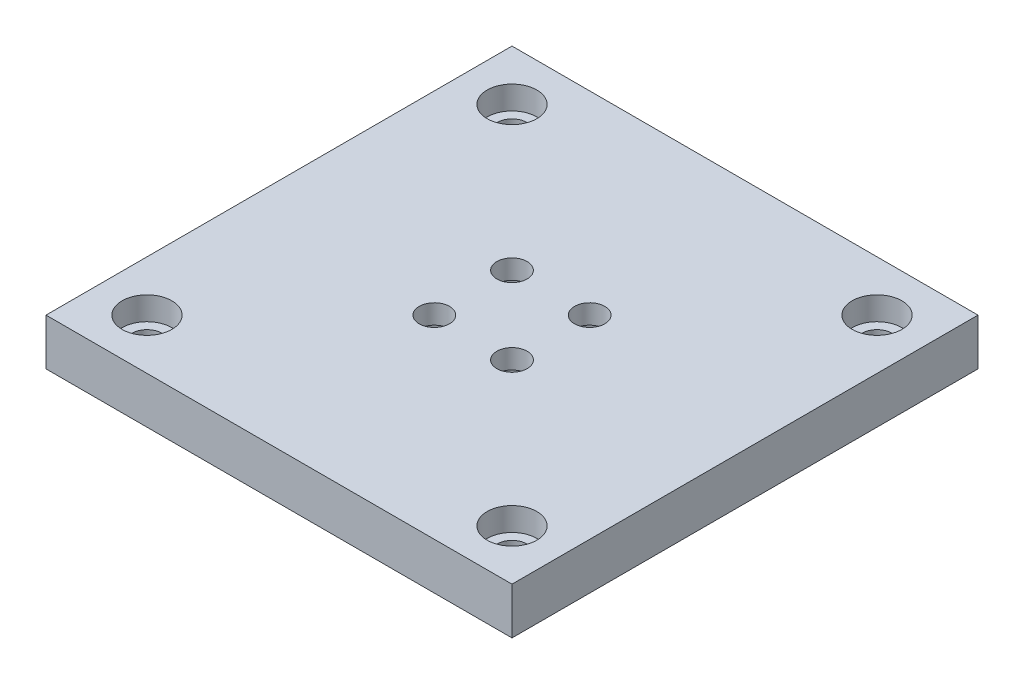
ISO-10303-21;
HEADER;
FILE_DESCRIPTION(('STEP AP214'),'2;1');
FILE_NAME('part.step','',(''),(''),'','','');
FILE_SCHEMA(('AUTOMOTIVE_DESIGN { 1 0 10303 214 1 1 1 1 }'));
ENDSEC;
DATA;
#1=APPLICATION_CONTEXT('core data for automotive mechanical design processes');
#2=APPLICATION_PROTOCOL_DEFINITION('international standard','automotive_design',2000,#1);
#3=PRODUCT_CONTEXT('',#1,'mechanical');
#4=PRODUCT('Part','Part','',(#3));
#5=PRODUCT_RELATED_PRODUCT_CATEGORY('part','',(#4));
#6=PRODUCT_DEFINITION_FORMATION('','',#4);
#7=PRODUCT_DEFINITION_CONTEXT('part definition',#1,'design');
#8=PRODUCT_DEFINITION('design','',#6,#7);
#9=PRODUCT_DEFINITION_SHAPE('','',#8);
#10=(LENGTH_UNIT() NAMED_UNIT(*) SI_UNIT(.MILLI.,.METRE.));
#11=(NAMED_UNIT(*) PLANE_ANGLE_UNIT() SI_UNIT($,.RADIAN.));
#12=(NAMED_UNIT(*) SI_UNIT($,.STERADIAN.) SOLID_ANGLE_UNIT());
#13=UNCERTAINTY_MEASURE_WITH_UNIT(LENGTH_MEASURE(1.E-05),#10,'distance_accuracy_value','');
#14=(GEOMETRIC_REPRESENTATION_CONTEXT(3) GLOBAL_UNCERTAINTY_ASSIGNED_CONTEXT((#13)) GLOBAL_UNIT_ASSIGNED_CONTEXT((#10,
#11,#12)) REPRESENTATION_CONTEXT('',''));
#15=CARTESIAN_POINT('',(0.,0.,0.));
#16=DIRECTION('',(0.,0.,1.));
#17=DIRECTION('',(1.,0.,0.));
#18=AXIS2_PLACEMENT_3D('',#15,#16,#17);
#19=CARTESIAN_POINT('',(-5.,6.,0.));
#20=DIRECTION('',(1.,0.,0.));
#21=DIRECTION('',(0.,0.,-1.));
#22=AXIS2_PLACEMENT_3D('',#19,#20,#21);
#23=PLANE('',#22);
#24=DIRECTION('',(0.,0.,1.));
#25=VECTOR('',#24,1.);
#26=CARTESIAN_POINT('',(-5.,0.,0.));
#27=LINE('',#26,#25);
#28=CARTESIAN_POINT('',(-5.,0.,-60.));
#29=VERTEX_POINT('',#28);
#30=CARTESIAN_POINT('',(-5.,0.,0.));
#31=VERTEX_POINT('',#30);
#32=EDGE_CURVE('E104',#29,#31,#27,.T.);
#33=ORIENTED_EDGE('',*,*,#32,.T.);
#34=DIRECTION('',(0.,-1.,0.));
#35=VECTOR('',#34,1.);
#36=CARTESIAN_POINT('',(-5.,6.,0.));
#37=LINE('',#36,#35);
#38=CARTESIAN_POINT('',(-5.,6.,0.));
#39=VERTEX_POINT('',#38);
#40=EDGE_CURVE('E11',#39,#31,#37,.T.);
#41=ORIENTED_EDGE('',*,*,#40,.F.);
#42=DIRECTION('',(0.,0.,1.));
#43=VECTOR('',#42,1.);
#44=CARTESIAN_POINT('',(-5.,6.,0.));
#45=LINE('',#44,#43);
#46=CARTESIAN_POINT('',(-5.,6.,-60.));
#47=VERTEX_POINT('',#46);
#48=EDGE_CURVE('E91',#47,#39,#45,.T.);
#49=ORIENTED_EDGE('',*,*,#48,.F.);
#50=DIRECTION('',(0.,-1.,0.));
#51=VECTOR('',#50,1.);
#52=CARTESIAN_POINT('',(-5.,6.,-60.));
#53=LINE('',#52,#51);
#54=EDGE_CURVE('E100',#47,#29,#53,.T.);
#55=ORIENTED_EDGE('',*,*,#54,.T.);
#56=EDGE_LOOP('',(#33,#41,#49,#55));
#57=FACE_BOUND('',#56,.T.);
#58=ADVANCED_FACE('F38',(#57),#23,.F.);
#59=CARTESIAN_POINT('',(-5.,6.,0.));
#60=DIRECTION('',(0.,0.,-1.));
#61=DIRECTION('',(-1.,0.,0.));
#62=AXIS2_PLACEMENT_3D('',#59,#60,#61);
#63=PLANE('',#62);
#64=DIRECTION('',(1.,0.,0.));
#65=VECTOR('',#64,1.);
#66=CARTESIAN_POINT('',(-5.,0.,0.));
#67=LINE('',#66,#65);
#68=CARTESIAN_POINT('',(55.,0.,0.));
#69=VERTEX_POINT('',#68);
#70=EDGE_CURVE('E95',#31,#69,#67,.T.);
#71=ORIENTED_EDGE('',*,*,#70,.T.);
#72=DIRECTION('',(0.,-1.,0.));
#73=VECTOR('',#72,1.);
#74=CARTESIAN_POINT('',(55.,6.,0.));
#75=LINE('',#74,#73);
#76=CARTESIAN_POINT('',(55.,6.,0.));
#77=VERTEX_POINT('',#76);
#78=EDGE_CURVE('E47',#77,#69,#75,.T.);
#79=ORIENTED_EDGE('',*,*,#78,.F.);
#80=DIRECTION('',(1.,0.,0.));
#81=VECTOR('',#80,1.);
#82=CARTESIAN_POINT('',(-5.,6.,0.));
#83=LINE('',#82,#81);
#84=EDGE_CURVE('E86',#39,#77,#83,.T.);
#85=ORIENTED_EDGE('',*,*,#84,.F.);
#86=ORIENTED_EDGE('',*,*,#40,.T.);
#87=EDGE_LOOP('',(#71,#79,#85,#86));
#88=FACE_BOUND('',#87,.T.);
#89=ADVANCED_FACE('F94',(#88),#63,.F.);
#90=CARTESIAN_POINT('',(55.,6.,0.));
#91=DIRECTION('',(-1.,0.,0.));
#92=DIRECTION('',(0.,0.,1.));
#93=AXIS2_PLACEMENT_3D('',#90,#91,#92);
#94=PLANE('',#93);
#95=DIRECTION('',(0.,0.,-1.));
#96=VECTOR('',#95,1.);
#97=CARTESIAN_POINT('',(55.,0.,0.));
#98=LINE('',#97,#96);
#99=CARTESIAN_POINT('',(55.,0.,-60.));
#100=VERTEX_POINT('',#99);
#101=EDGE_CURVE('E73',#69,#100,#98,.T.);
#102=ORIENTED_EDGE('',*,*,#101,.T.);
#103=DIRECTION('',(0.,-1.,0.));
#104=VECTOR('',#103,1.);
#105=CARTESIAN_POINT('',(55.,6.,-60.));
#106=LINE('',#105,#104);
#107=CARTESIAN_POINT('',(55.,6.,-60.));
#108=VERTEX_POINT('',#107);
#109=EDGE_CURVE('E96',#108,#100,#106,.T.);
#110=ORIENTED_EDGE('',*,*,#109,.F.);
#111=DIRECTION('',(0.,0.,-1.));
#112=VECTOR('',#111,1.);
#113=CARTESIAN_POINT('',(55.,6.,0.));
#114=LINE('',#113,#112);
#115=EDGE_CURVE('E89',#77,#108,#114,.T.);
#116=ORIENTED_EDGE('',*,*,#115,.F.);
#117=ORIENTED_EDGE('',*,*,#78,.T.);
#118=EDGE_LOOP('',(#102,#110,#116,#117));
#119=FACE_BOUND('',#118,.T.);
#120=ADVANCED_FACE('F98',(#119),#94,.F.);
#121=CARTESIAN_POINT('',(-5.,6.,-60.));
#122=DIRECTION('',(0.,0.,1.));
#123=DIRECTION('',(1.,0.,0.));
#124=AXIS2_PLACEMENT_3D('',#121,#122,#123);
#125=PLANE('',#124);
#126=DIRECTION('',(-1.,0.,0.));
#127=VECTOR('',#126,1.);
#128=CARTESIAN_POINT('',(-5.,0.,-60.));
#129=LINE('',#128,#127);
#130=EDGE_CURVE('E79',#100,#29,#129,.T.);
#131=ORIENTED_EDGE('',*,*,#130,.T.);
#132=ORIENTED_EDGE('',*,*,#54,.F.);
#133=DIRECTION('',(-1.,0.,0.));
#134=VECTOR('',#133,1.);
#135=CARTESIAN_POINT('',(-5.,6.,-60.));
#136=LINE('',#135,#134);
#137=EDGE_CURVE('E56',#108,#47,#136,.T.);
#138=ORIENTED_EDGE('',*,*,#137,.F.);
#139=ORIENTED_EDGE('',*,*,#109,.T.);
#140=EDGE_LOOP('',(#131,#132,#138,#139));
#141=FACE_BOUND('',#140,.T.);
#142=ADVANCED_FACE('F226',(#141),#125,.F.);
#143=CARTESIAN_POINT('',(0.,6.,0.));
#144=DIRECTION('',(0.,-1.,0.));
#145=DIRECTION('',(0.,0.,-1.));
#146=AXIS2_PLACEMENT_3D('',#143,#144,#145);
#147=PLANE('',#146);
#148=CARTESIAN_POINT('',(1.5,6.,-53.5));
#149=DIRECTION('',(0.,1.,0.));
#150=DIRECTION('',(0.,0.,1.));
#151=AXIS2_PLACEMENT_3D('',#148,#149,#150);
#152=CIRCLE('',#151,3.20000000000002);
#153=CARTESIAN_POINT('',(1.5,6.,-50.3));
#154=VERTEX_POINT('',#153);
#155=EDGE_CURVE('E498',#154,#154,#152,.T.);
#156=ORIENTED_EDGE('',*,*,#155,.F.);
#157=EDGE_LOOP('',(#156));
#158=FACE_BOUND('',#157,.T.);
#159=CARTESIAN_POINT('',(48.5,6.,-53.5));
#160=DIRECTION('',(0.,1.,0.));
#161=DIRECTION('',(0.,0.,1.));
#162=AXIS2_PLACEMENT_3D('',#159,#160,#161);
#163=CIRCLE('',#162,3.20000000000002);
#164=CARTESIAN_POINT('',(48.5,6.,-50.3));
#165=VERTEX_POINT('',#164);
#166=EDGE_CURVE('E137',#165,#165,#163,.T.);
#167=ORIENTED_EDGE('',*,*,#166,.F.);
#168=EDGE_LOOP('',(#167));
#169=FACE_BOUND('',#168,.T.);
#170=CARTESIAN_POINT('',(48.5,6.,-6.5));
#171=DIRECTION('',(0.,1.,0.));
#172=DIRECTION('',(0.,0.,1.));
#173=AXIS2_PLACEMENT_3D('',#170,#171,#172);
#174=CIRCLE('',#173,3.20000000000002);
#175=CARTESIAN_POINT('',(48.5,6.,-3.29999999999998));
#176=VERTEX_POINT('',#175);
#177=EDGE_CURVE('E124',#176,#176,#174,.T.);
#178=ORIENTED_EDGE('',*,*,#177,.F.);
#179=EDGE_LOOP('',(#178));
#180=FACE_BOUND('',#179,.T.);
#181=CARTESIAN_POINT('',(1.5,6.,-6.5));
#182=DIRECTION('',(0.,1.,0.));
#183=DIRECTION('',(0.,0.,1.));
#184=AXIS2_PLACEMENT_3D('',#181,#182,#183);
#185=CIRCLE('',#184,3.20000000000002);
#186=CARTESIAN_POINT('',(1.5,6.,-3.29999999999998));
#187=VERTEX_POINT('',#186);
#188=EDGE_CURVE('E120',#187,#187,#185,.T.);
#189=ORIENTED_EDGE('',*,*,#188,.F.);
#190=EDGE_LOOP('',(#189));
#191=FACE_BOUND('',#190,.T.);
#192=CARTESIAN_POINT('',(20.,6.,-25.));
#193=DIRECTION('',(0.,-1.,0.));
#194=DIRECTION('',(0.,0.,-1.));
#195=AXIS2_PLACEMENT_3D('',#192,#193,#194);
#196=CIRCLE('',#195,1.95000000000001);
#197=CARTESIAN_POINT('',(20.,6.,-26.95));
#198=VERTEX_POINT('',#197);
#199=EDGE_CURVE('E160',#198,#198,#196,.T.);
#200=ORIENTED_EDGE('',*,*,#199,.T.);
#201=EDGE_LOOP('',(#200));
#202=FACE_BOUND('',#201,.T.);
#203=CARTESIAN_POINT('',(30.,6.,-25.));
#204=DIRECTION('',(0.,-1.,0.));
#205=DIRECTION('',(0.,0.,-1.));
#206=AXIS2_PLACEMENT_3D('',#203,#204,#205);
#207=CIRCLE('',#206,1.95000000000001);
#208=CARTESIAN_POINT('',(30.,6.,-26.95));
#209=VERTEX_POINT('',#208);
#210=EDGE_CURVE('E172',#209,#209,#207,.T.);
#211=ORIENTED_EDGE('',*,*,#210,.T.);
#212=EDGE_LOOP('',(#211));
#213=FACE_BOUND('',#212,.T.);
#214=CARTESIAN_POINT('',(30.,6.,-35.));
#215=DIRECTION('',(0.,-1.,0.));
#216=DIRECTION('',(0.,0.,-1.));
#217=AXIS2_PLACEMENT_3D('',#214,#215,#216);
#218=CIRCLE('',#217,1.95000000000001);
#219=CARTESIAN_POINT('',(30.,6.,-36.95));
#220=VERTEX_POINT('',#219);
#221=EDGE_CURVE('E184',#220,#220,#218,.T.);
#222=ORIENTED_EDGE('',*,*,#221,.T.);
#223=EDGE_LOOP('',(#222));
#224=FACE_BOUND('',#223,.T.);
#225=CARTESIAN_POINT('',(20.,6.,-35.));
#226=DIRECTION('',(0.,-1.,0.));
#227=DIRECTION('',(0.,0.,-1.));
#228=AXIS2_PLACEMENT_3D('',#225,#226,#227);
#229=CIRCLE('',#228,1.95000000000001);
#230=CARTESIAN_POINT('',(20.,6.,-36.95));
#231=VERTEX_POINT('',#230);
#232=EDGE_CURVE('E107',#231,#231,#229,.T.);
#233=ORIENTED_EDGE('',*,*,#232,.T.);
#234=EDGE_LOOP('',(#233));
#235=FACE_BOUND('',#234,.T.);
#236=ORIENTED_EDGE('',*,*,#48,.T.);
#237=ORIENTED_EDGE('',*,*,#84,.T.);
#238=ORIENTED_EDGE('',*,*,#115,.T.);
#239=ORIENTED_EDGE('',*,*,#137,.T.);
#240=EDGE_LOOP('',(#236,#237,#238,#239));
#241=FACE_BOUND('',#240,.T.);
#242=ADVANCED_FACE('F87',(#158,#169,#180,#191,#202,#213,#224,#235,#241),#147,.F.);
#243=CARTESIAN_POINT('',(0.,0.,0.));
#244=DIRECTION('',(0.,-1.,0.));
#245=DIRECTION('',(0.,0.,-1.));
#246=AXIS2_PLACEMENT_3D('',#243,#244,#245);
#247=PLANE('',#246);
#248=CARTESIAN_POINT('',(1.5,0.,-53.5));
#249=DIRECTION('',(0.,-1.,0.));
#250=DIRECTION('',(0.,0.,-1.));
#251=AXIS2_PLACEMENT_3D('',#248,#249,#250);
#252=CIRCLE('',#251,1.95000000000001);
#253=CARTESIAN_POINT('',(1.5,0.,-55.45));
#254=VERTEX_POINT('',#253);
#255=EDGE_CURVE('E41',#254,#254,#252,.T.);
#256=ORIENTED_EDGE('',*,*,#255,.F.);
#257=EDGE_LOOP('',(#256));
#258=FACE_BOUND('',#257,.T.);
#259=CARTESIAN_POINT('',(48.5,0.,-53.5));
#260=DIRECTION('',(0.,-1.,0.));
#261=DIRECTION('',(0.,0.,-1.));
#262=AXIS2_PLACEMENT_3D('',#259,#260,#261);
#263=CIRCLE('',#262,1.95000000000001);
#264=CARTESIAN_POINT('',(48.5,0.,-55.45));
#265=VERTEX_POINT('',#264);
#266=EDGE_CURVE('E122',#265,#265,#263,.T.);
#267=ORIENTED_EDGE('',*,*,#266,.F.);
#268=EDGE_LOOP('',(#267));
#269=FACE_BOUND('',#268,.T.);
#270=CARTESIAN_POINT('',(48.5,0.,-6.5));
#271=DIRECTION('',(0.,-1.,0.));
#272=DIRECTION('',(0.,0.,-1.));
#273=AXIS2_PLACEMENT_3D('',#270,#271,#272);
#274=CIRCLE('',#273,1.95000000000001);
#275=CARTESIAN_POINT('',(48.5,0.,-8.45000000000001));
#276=VERTEX_POINT('',#275);
#277=EDGE_CURVE('E118',#276,#276,#274,.T.);
#278=ORIENTED_EDGE('',*,*,#277,.F.);
#279=EDGE_LOOP('',(#278));
#280=FACE_BOUND('',#279,.T.);
#281=CARTESIAN_POINT('',(1.5,0.,-6.5));
#282=DIRECTION('',(0.,-1.,0.));
#283=DIRECTION('',(0.,0.,-1.));
#284=AXIS2_PLACEMENT_3D('',#281,#282,#283);
#285=CIRCLE('',#284,1.95000000000001);
#286=CARTESIAN_POINT('',(1.5,0.,-8.45000000000001));
#287=VERTEX_POINT('',#286);
#288=EDGE_CURVE('E113',#287,#287,#285,.T.);
#289=ORIENTED_EDGE('',*,*,#288,.F.);
#290=EDGE_LOOP('',(#289));
#291=FACE_BOUND('',#290,.T.);
#292=CARTESIAN_POINT('',(20.,0.,-25.));
#293=DIRECTION('',(0.,-1.,0.));
#294=DIRECTION('',(0.,0.,-1.));
#295=AXIS2_PLACEMENT_3D('',#292,#293,#294);
#296=CIRCLE('',#295,3.20000000000001);
#297=CARTESIAN_POINT('',(20.,0.,-28.2));
#298=VERTEX_POINT('',#297);
#299=EDGE_CURVE('E116',#298,#298,#296,.T.);
#300=ORIENTED_EDGE('',*,*,#299,.F.);
#301=EDGE_LOOP('',(#300));
#302=FACE_BOUND('',#301,.T.);
#303=CARTESIAN_POINT('',(30.,0.,-25.));
#304=DIRECTION('',(0.,-1.,0.));
#305=DIRECTION('',(0.,0.,-1.));
#306=AXIS2_PLACEMENT_3D('',#303,#304,#305);
#307=CIRCLE('',#306,3.20000000000002);
#308=CARTESIAN_POINT('',(30.,0.,-28.2));
#309=VERTEX_POINT('',#308);
#310=EDGE_CURVE('E163',#309,#309,#307,.T.);
#311=ORIENTED_EDGE('',*,*,#310,.F.);
#312=EDGE_LOOP('',(#311));
#313=FACE_BOUND('',#312,.T.);
#314=CARTESIAN_POINT('',(30.,0.,-35.));
#315=DIRECTION('',(0.,-1.,0.));
#316=DIRECTION('',(0.,0.,-1.));
#317=AXIS2_PLACEMENT_3D('',#314,#315,#316);
#318=CIRCLE('',#317,3.20000000000002);
#319=CARTESIAN_POINT('',(30.,0.,-38.2));
#320=VERTEX_POINT('',#319);
#321=EDGE_CURVE('E175',#320,#320,#318,.T.);
#322=ORIENTED_EDGE('',*,*,#321,.F.);
#323=EDGE_LOOP('',(#322));
#324=FACE_BOUND('',#323,.T.);
#325=CARTESIAN_POINT('',(20.,0.,-35.));
#326=DIRECTION('',(0.,-1.,0.));
#327=DIRECTION('',(0.,0.,-1.));
#328=AXIS2_PLACEMENT_3D('',#325,#326,#327);
#329=CIRCLE('',#328,3.20000000000001);
#330=CARTESIAN_POINT('',(20.,0.,-38.2));
#331=VERTEX_POINT('',#330);
#332=EDGE_CURVE('E187',#331,#331,#329,.T.);
#333=ORIENTED_EDGE('',*,*,#332,.F.);
#334=EDGE_LOOP('',(#333));
#335=FACE_BOUND('',#334,.T.);
#336=ORIENTED_EDGE('',*,*,#32,.F.);
#337=ORIENTED_EDGE('',*,*,#130,.F.);
#338=ORIENTED_EDGE('',*,*,#101,.F.);
#339=ORIENTED_EDGE('',*,*,#70,.F.);
#340=EDGE_LOOP('',(#336,#337,#338,#339));
#341=FACE_BOUND('',#340,.T.);
#342=ADVANCED_FACE('F204',(#258,#269,#280,#291,#302,#313,#324,#335,#341),#247,.T.);
#343=CARTESIAN_POINT('',(20.,0.,-35.));
#344=DIRECTION('',(0.,-1.,0.));
#345=DIRECTION('',(0.,0.,-1.));
#346=AXIS2_PLACEMENT_3D('',#343,#344,#345);
#347=CYLINDRICAL_SURFACE('',#346,1.95000000000001);
#348=ORIENTED_EDGE('',*,*,#232,.F.);
#349=EDGE_LOOP('',(#348));
#350=FACE_BOUND('',#349,.T.);
#351=CARTESIAN_POINT('',(20.,3.5,-35.));
#352=DIRECTION('',(0.,-1.,0.));
#353=DIRECTION('',(0.,0.,-1.));
#354=AXIS2_PLACEMENT_3D('',#351,#352,#353);
#355=CIRCLE('',#354,1.95000000000001);
#356=CARTESIAN_POINT('',(20.,3.5,-36.95));
#357=VERTEX_POINT('',#356);
#358=EDGE_CURVE('E193',#357,#357,#355,.T.);
#359=ORIENTED_EDGE('',*,*,#358,.T.);
#360=EDGE_LOOP('',(#359));
#361=FACE_BOUND('',#360,.T.);
#362=ADVANCED_FACE('F200',(#350,#361),#347,.F.);
#363=CARTESIAN_POINT('',(21.95,3.5,-35.));
#364=DIRECTION('',(0.,1.,0.));
#365=DIRECTION('',(0.,0.,1.));
#366=AXIS2_PLACEMENT_3D('',#363,#364,#365);
#367=PLANE('',#366);
#368=ORIENTED_EDGE('',*,*,#358,.F.);
#369=EDGE_LOOP('',(#368));
#370=FACE_BOUND('',#369,.T.);
#371=CARTESIAN_POINT('',(20.,3.5,-35.));
#372=DIRECTION('',(0.,-1.,0.));
#373=DIRECTION('',(0.,0.,-1.));
#374=AXIS2_PLACEMENT_3D('',#371,#372,#373);
#375=CIRCLE('',#374,3.20000000000001);
#376=CARTESIAN_POINT('',(20.,3.5,-38.2));
#377=VERTEX_POINT('',#376);
#378=EDGE_CURVE('E190',#377,#377,#375,.T.);
#379=ORIENTED_EDGE('',*,*,#378,.T.);
#380=EDGE_LOOP('',(#379));
#381=FACE_BOUND('',#380,.T.);
#382=ADVANCED_FACE('F203',(#370,#381),#367,.F.);
#383=CARTESIAN_POINT('',(20.,0.,-35.));
#384=DIRECTION('',(0.,-1.,0.));
#385=DIRECTION('',(0.,0.,-1.));
#386=AXIS2_PLACEMENT_3D('',#383,#384,#385);
#387=CYLINDRICAL_SURFACE('',#386,3.20000000000001);
#388=ORIENTED_EDGE('',*,*,#378,.F.);
#389=EDGE_LOOP('',(#388));
#390=FACE_BOUND('',#389,.T.);
#391=ORIENTED_EDGE('',*,*,#332,.T.);
#392=EDGE_LOOP('',(#391));
#393=FACE_BOUND('',#392,.T.);
#394=ADVANCED_FACE('F210',(#390,#393),#387,.F.);
#395=CARTESIAN_POINT('',(30.,0.,-35.));
#396=DIRECTION('',(0.,-1.,0.));
#397=DIRECTION('',(0.,0.,-1.));
#398=AXIS2_PLACEMENT_3D('',#395,#396,#397);
#399=CYLINDRICAL_SURFACE('',#398,1.95000000000001);
#400=ORIENTED_EDGE('',*,*,#221,.F.);
#401=EDGE_LOOP('',(#400));
#402=FACE_BOUND('',#401,.T.);
#403=CARTESIAN_POINT('',(30.,3.5,-35.));
#404=DIRECTION('',(0.,-1.,0.));
#405=DIRECTION('',(0.,0.,-1.));
#406=AXIS2_PLACEMENT_3D('',#403,#404,#405);
#407=CIRCLE('',#406,1.95000000000001);
#408=CARTESIAN_POINT('',(30.,3.5,-36.95));
#409=VERTEX_POINT('',#408);
#410=EDGE_CURVE('E181',#409,#409,#407,.T.);
#411=ORIENTED_EDGE('',*,*,#410,.T.);
#412=EDGE_LOOP('',(#411));
#413=FACE_BOUND('',#412,.T.);
#414=ADVANCED_FACE('F216',(#402,#413),#399,.F.);
#415=CARTESIAN_POINT('',(31.95,3.5,-35.));
#416=DIRECTION('',(0.,1.,0.));
#417=DIRECTION('',(0.,0.,1.));
#418=AXIS2_PLACEMENT_3D('',#415,#416,#417);
#419=PLANE('',#418);
#420=ORIENTED_EDGE('',*,*,#410,.F.);
#421=EDGE_LOOP('',(#420));
#422=FACE_BOUND('',#421,.T.);
#423=CARTESIAN_POINT('',(30.,3.5,-35.));
#424=DIRECTION('',(0.,-1.,0.));
#425=DIRECTION('',(0.,0.,-1.));
#426=AXIS2_PLACEMENT_3D('',#423,#424,#425);
#427=CIRCLE('',#426,3.20000000000002);
#428=CARTESIAN_POINT('',(30.,3.5,-38.2));
#429=VERTEX_POINT('',#428);
#430=EDGE_CURVE('E178',#429,#429,#427,.T.);
#431=ORIENTED_EDGE('',*,*,#430,.T.);
#432=EDGE_LOOP('',(#431));
#433=FACE_BOUND('',#432,.T.);
#434=ADVANCED_FACE('F279',(#422,#433),#419,.F.);
#435=CARTESIAN_POINT('',(30.,0.,-35.));
#436=DIRECTION('',(0.,-1.,0.));
#437=DIRECTION('',(0.,0.,-1.));
#438=AXIS2_PLACEMENT_3D('',#435,#436,#437);
#439=CYLINDRICAL_SURFACE('',#438,3.20000000000002);
#440=ORIENTED_EDGE('',*,*,#430,.F.);
#441=EDGE_LOOP('',(#440));
#442=FACE_BOUND('',#441,.T.);
#443=ORIENTED_EDGE('',*,*,#321,.T.);
#444=EDGE_LOOP('',(#443));
#445=FACE_BOUND('',#444,.T.);
#446=ADVANCED_FACE('F289',(#442,#445),#439,.F.);
#447=CARTESIAN_POINT('',(30.,0.,-25.));
#448=DIRECTION('',(0.,-1.,0.));
#449=DIRECTION('',(0.,0.,-1.));
#450=AXIS2_PLACEMENT_3D('',#447,#448,#449);
#451=CYLINDRICAL_SURFACE('',#450,1.95000000000001);
#452=ORIENTED_EDGE('',*,*,#210,.F.);
#453=EDGE_LOOP('',(#452));
#454=FACE_BOUND('',#453,.T.);
#455=CARTESIAN_POINT('',(30.,3.5,-25.));
#456=DIRECTION('',(0.,-1.,0.));
#457=DIRECTION('',(0.,0.,-1.));
#458=AXIS2_PLACEMENT_3D('',#455,#456,#457);
#459=CIRCLE('',#458,1.95000000000001);
#460=CARTESIAN_POINT('',(30.,3.5,-26.95));
#461=VERTEX_POINT('',#460);
#462=EDGE_CURVE('E169',#461,#461,#459,.T.);
#463=ORIENTED_EDGE('',*,*,#462,.T.);
#464=EDGE_LOOP('',(#463));
#465=FACE_BOUND('',#464,.T.);
#466=ADVANCED_FACE('F299',(#454,#465),#451,.F.);
#467=CARTESIAN_POINT('',(31.95,3.5,-25.));
#468=DIRECTION('',(0.,1.,0.));
#469=DIRECTION('',(0.,0.,1.));
#470=AXIS2_PLACEMENT_3D('',#467,#468,#469);
#471=PLANE('',#470);
#472=ORIENTED_EDGE('',*,*,#462,.F.);
#473=EDGE_LOOP('',(#472));
#474=FACE_BOUND('',#473,.T.);
#475=CARTESIAN_POINT('',(30.,3.5,-25.));
#476=DIRECTION('',(0.,-1.,0.));
#477=DIRECTION('',(0.,0.,-1.));
#478=AXIS2_PLACEMENT_3D('',#475,#476,#477);
#479=CIRCLE('',#478,3.20000000000002);
#480=CARTESIAN_POINT('',(30.,3.5,-28.2));
#481=VERTEX_POINT('',#480);
#482=EDGE_CURVE('E166',#481,#481,#479,.T.);
#483=ORIENTED_EDGE('',*,*,#482,.T.);
#484=EDGE_LOOP('',(#483));
#485=FACE_BOUND('',#484,.T.);
#486=ADVANCED_FACE('F309',(#474,#485),#471,.F.);
#487=CARTESIAN_POINT('',(30.,0.,-25.));
#488=DIRECTION('',(0.,-1.,0.));
#489=DIRECTION('',(0.,0.,-1.));
#490=AXIS2_PLACEMENT_3D('',#487,#488,#489);
#491=CYLINDRICAL_SURFACE('',#490,3.20000000000002);
#492=ORIENTED_EDGE('',*,*,#482,.F.);
#493=EDGE_LOOP('',(#492));
#494=FACE_BOUND('',#493,.T.);
#495=ORIENTED_EDGE('',*,*,#310,.T.);
#496=EDGE_LOOP('',(#495));
#497=FACE_BOUND('',#496,.T.);
#498=ADVANCED_FACE('F319',(#494,#497),#491,.F.);
#499=CARTESIAN_POINT('',(20.,0.,-25.));
#500=DIRECTION('',(0.,-1.,0.));
#501=DIRECTION('',(0.,0.,-1.));
#502=AXIS2_PLACEMENT_3D('',#499,#500,#501);
#503=CYLINDRICAL_SURFACE('',#502,1.95000000000001);
#504=ORIENTED_EDGE('',*,*,#199,.F.);
#505=EDGE_LOOP('',(#504));
#506=FACE_BOUND('',#505,.T.);
#507=CARTESIAN_POINT('',(20.,3.5,-25.));
#508=DIRECTION('',(0.,-1.,0.));
#509=DIRECTION('',(0.,0.,-1.));
#510=AXIS2_PLACEMENT_3D('',#507,#508,#509);
#511=CIRCLE('',#510,1.95000000000001);
#512=CARTESIAN_POINT('',(20.,3.5,-26.95));
#513=VERTEX_POINT('',#512);
#514=EDGE_CURVE('E157',#513,#513,#511,.T.);
#515=ORIENTED_EDGE('',*,*,#514,.T.);
#516=EDGE_LOOP('',(#515));
#517=FACE_BOUND('',#516,.T.);
#518=ADVANCED_FACE('F329',(#506,#517),#503,.F.);
#519=CARTESIAN_POINT('',(21.95,3.5,-25.));
#520=DIRECTION('',(0.,1.,0.));
#521=DIRECTION('',(0.,0.,1.));
#522=AXIS2_PLACEMENT_3D('',#519,#520,#521);
#523=PLANE('',#522);
#524=ORIENTED_EDGE('',*,*,#514,.F.);
#525=EDGE_LOOP('',(#524));
#526=FACE_BOUND('',#525,.T.);
#527=CARTESIAN_POINT('',(20.,3.5,-25.));
#528=DIRECTION('',(0.,-1.,0.));
#529=DIRECTION('',(0.,0.,-1.));
#530=AXIS2_PLACEMENT_3D('',#527,#528,#529);
#531=CIRCLE('',#530,3.20000000000001);
#532=CARTESIAN_POINT('',(20.,3.5,-28.2));
#533=VERTEX_POINT('',#532);
#534=EDGE_CURVE('E154',#533,#533,#531,.T.);
#535=ORIENTED_EDGE('',*,*,#534,.T.);
#536=EDGE_LOOP('',(#535));
#537=FACE_BOUND('',#536,.T.);
#538=ADVANCED_FACE('F339',(#526,#537),#523,.F.);
#539=CARTESIAN_POINT('',(20.,0.,-25.));
#540=DIRECTION('',(0.,-1.,0.));
#541=DIRECTION('',(0.,0.,-1.));
#542=AXIS2_PLACEMENT_3D('',#539,#540,#541);
#543=CYLINDRICAL_SURFACE('',#542,3.20000000000001);
#544=ORIENTED_EDGE('',*,*,#534,.F.);
#545=EDGE_LOOP('',(#544));
#546=FACE_BOUND('',#545,.T.);
#547=ORIENTED_EDGE('',*,*,#299,.T.);
#548=EDGE_LOOP('',(#547));
#549=FACE_BOUND('',#548,.T.);
#550=ADVANCED_FACE('F349',(#546,#549),#543,.F.);
#551=CARTESIAN_POINT('',(1.5,6.,-6.5));
#552=DIRECTION('',(0.,1.,0.));
#553=DIRECTION('',(0.,0.,1.));
#554=AXIS2_PLACEMENT_3D('',#551,#552,#553);
#555=CYLINDRICAL_SURFACE('',#554,1.95000000000001);
#556=ORIENTED_EDGE('',*,*,#288,.T.);
#557=EDGE_LOOP('',(#556));
#558=FACE_BOUND('',#557,.T.);
#559=CARTESIAN_POINT('',(1.5,3.,-6.5));
#560=DIRECTION('',(0.,1.,0.));
#561=DIRECTION('',(0.,0.,1.));
#562=AXIS2_PLACEMENT_3D('',#559,#560,#561);
#563=CIRCLE('',#562,1.95000000000001);
#564=CARTESIAN_POINT('',(1.5,3.,-4.54999999999999));
#565=VERTEX_POINT('',#564);
#566=EDGE_CURVE('E117',#565,#565,#563,.T.);
#567=ORIENTED_EDGE('',*,*,#566,.T.);
#568=EDGE_LOOP('',(#567));
#569=FACE_BOUND('',#568,.T.);
#570=ADVANCED_FACE('F359',(#558,#569),#555,.F.);
#571=CARTESIAN_POINT('',(3.45000000000001,3.,-6.5));
#572=DIRECTION('',(0.,-1.,0.));
#573=DIRECTION('',(0.,0.,-1.));
#574=AXIS2_PLACEMENT_3D('',#571,#572,#573);
#575=PLANE('',#574);
#576=ORIENTED_EDGE('',*,*,#566,.F.);
#577=EDGE_LOOP('',(#576));
#578=FACE_BOUND('',#577,.T.);
#579=CARTESIAN_POINT('',(1.5,3.,-6.5));
#580=DIRECTION('',(0.,1.,0.));
#581=DIRECTION('',(0.,0.,1.));
#582=AXIS2_PLACEMENT_3D('',#579,#580,#581);
#583=CIRCLE('',#582,3.20000000000001);
#584=CARTESIAN_POINT('',(1.5,3.,-3.29999999999999));
#585=VERTEX_POINT('',#584);
#586=EDGE_CURVE('E147',#585,#585,#583,.T.);
#587=ORIENTED_EDGE('',*,*,#586,.T.);
#588=EDGE_LOOP('',(#587));
#589=FACE_BOUND('',#588,.T.);
#590=ADVANCED_FACE('F379',(#578,#589),#575,.F.);
#591=CARTESIAN_POINT('',(1.5,6.,-6.5));
#592=DIRECTION('',(0.,1.,0.));
#593=DIRECTION('',(0.,0.,1.));
#594=AXIS2_PLACEMENT_3D('',#591,#592,#593);
#595=CYLINDRICAL_SURFACE('',#594,3.20000000000001);
#596=ORIENTED_EDGE('',*,*,#586,.F.);
#597=EDGE_LOOP('',(#596));
#598=FACE_BOUND('',#597,.T.);
#599=ORIENTED_EDGE('',*,*,#188,.T.);
#600=EDGE_LOOP('',(#599));
#601=FACE_BOUND('',#600,.T.);
#602=ADVANCED_FACE('F389',(#598,#601),#595,.F.);
#603=CARTESIAN_POINT('',(48.5,6.,-6.5));
#604=DIRECTION('',(0.,1.,0.));
#605=DIRECTION('',(0.,0.,1.));
#606=AXIS2_PLACEMENT_3D('',#603,#604,#605);
#607=CYLINDRICAL_SURFACE('',#606,1.95000000000001);
#608=ORIENTED_EDGE('',*,*,#277,.T.);
#609=EDGE_LOOP('',(#608));
#610=FACE_BOUND('',#609,.T.);
#611=CARTESIAN_POINT('',(48.5,3.,-6.5));
#612=DIRECTION('',(0.,1.,0.));
#613=DIRECTION('',(0.,0.,1.));
#614=AXIS2_PLACEMENT_3D('',#611,#612,#613);
#615=CIRCLE('',#614,1.95000000000001);
#616=CARTESIAN_POINT('',(48.5,3.,-4.54999999999998));
#617=VERTEX_POINT('',#616);
#618=EDGE_CURVE('E121',#617,#617,#615,.T.);
#619=ORIENTED_EDGE('',*,*,#618,.T.);
#620=EDGE_LOOP('',(#619));
#621=FACE_BOUND('',#620,.T.);
#622=ADVANCED_FACE('F399',(#610,#621),#607,.F.);
#623=CARTESIAN_POINT('',(50.45,3.,-6.5));
#624=DIRECTION('',(0.,-1.,0.));
#625=DIRECTION('',(0.,0.,-1.));
#626=AXIS2_PLACEMENT_3D('',#623,#624,#625);
#627=PLANE('',#626);
#628=ORIENTED_EDGE('',*,*,#618,.F.);
#629=EDGE_LOOP('',(#628));
#630=FACE_BOUND('',#629,.T.);
#631=CARTESIAN_POINT('',(48.5,3.,-6.5));
#632=DIRECTION('',(0.,1.,0.));
#633=DIRECTION('',(0.,0.,1.));
#634=AXIS2_PLACEMENT_3D('',#631,#632,#633);
#635=CIRCLE('',#634,3.20000000000002);
#636=CARTESIAN_POINT('',(48.5,3.,-3.29999999999998));
#637=VERTEX_POINT('',#636);
#638=EDGE_CURVE('E129',#637,#637,#635,.T.);
#639=ORIENTED_EDGE('',*,*,#638,.T.);
#640=EDGE_LOOP('',(#639));
#641=FACE_BOUND('',#640,.T.);
#642=ADVANCED_FACE('F409',(#630,#641),#627,.F.);
#643=CARTESIAN_POINT('',(48.5,6.,-6.5));
#644=DIRECTION('',(0.,1.,0.));
#645=DIRECTION('',(0.,0.,1.));
#646=AXIS2_PLACEMENT_3D('',#643,#644,#645);
#647=CYLINDRICAL_SURFACE('',#646,3.20000000000002);
#648=ORIENTED_EDGE('',*,*,#638,.F.);
#649=EDGE_LOOP('',(#648));
#650=FACE_BOUND('',#649,.T.);
#651=ORIENTED_EDGE('',*,*,#177,.T.);
#652=EDGE_LOOP('',(#651));
#653=FACE_BOUND('',#652,.T.);
#654=ADVANCED_FACE('F419',(#650,#653),#647,.F.);
#655=CARTESIAN_POINT('',(48.5,6.,-53.5));
#656=DIRECTION('',(0.,1.,0.));
#657=DIRECTION('',(0.,0.,1.));
#658=AXIS2_PLACEMENT_3D('',#655,#656,#657);
#659=CYLINDRICAL_SURFACE('',#658,1.95000000000001);
#660=ORIENTED_EDGE('',*,*,#266,.T.);
#661=EDGE_LOOP('',(#660));
#662=FACE_BOUND('',#661,.T.);
#663=CARTESIAN_POINT('',(48.5,3.,-53.5));
#664=DIRECTION('',(0.,1.,0.));
#665=DIRECTION('',(0.,0.,1.));
#666=AXIS2_PLACEMENT_3D('',#663,#664,#665);
#667=CIRCLE('',#666,1.95000000000001);
#668=CARTESIAN_POINT('',(48.5,3.,-51.55));
#669=VERTEX_POINT('',#668);
#670=EDGE_CURVE('E125',#669,#669,#667,.T.);
#671=ORIENTED_EDGE('',*,*,#670,.T.);
#672=EDGE_LOOP('',(#671));
#673=FACE_BOUND('',#672,.T.);
#674=ADVANCED_FACE('F429',(#662,#673),#659,.F.);
#675=CARTESIAN_POINT('',(50.45,3.,-53.5));
#676=DIRECTION('',(0.,-1.,0.));
#677=DIRECTION('',(0.,0.,-1.));
#678=AXIS2_PLACEMENT_3D('',#675,#676,#677);
#679=PLANE('',#678);
#680=ORIENTED_EDGE('',*,*,#670,.F.);
#681=EDGE_LOOP('',(#680));
#682=FACE_BOUND('',#681,.T.);
#683=CARTESIAN_POINT('',(48.5,3.,-53.5));
#684=DIRECTION('',(0.,1.,0.));
#685=DIRECTION('',(0.,0.,1.));
#686=AXIS2_PLACEMENT_3D('',#683,#684,#685);
#687=CIRCLE('',#686,3.20000000000002);
#688=CARTESIAN_POINT('',(48.5,3.,-50.3));
#689=VERTEX_POINT('',#688);
#690=EDGE_CURVE('E132',#689,#689,#687,.T.);
#691=ORIENTED_EDGE('',*,*,#690,.T.);
#692=EDGE_LOOP('',(#691));
#693=FACE_BOUND('',#692,.T.);
#694=ADVANCED_FACE('F439',(#682,#693),#679,.F.);
#695=CARTESIAN_POINT('',(48.5,6.,-53.5));
#696=DIRECTION('',(0.,1.,0.));
#697=DIRECTION('',(0.,0.,1.));
#698=AXIS2_PLACEMENT_3D('',#695,#696,#697);
#699=CYLINDRICAL_SURFACE('',#698,3.20000000000002);
#700=ORIENTED_EDGE('',*,*,#690,.F.);
#701=EDGE_LOOP('',(#700));
#702=FACE_BOUND('',#701,.T.);
#703=ORIENTED_EDGE('',*,*,#166,.T.);
#704=EDGE_LOOP('',(#703));
#705=FACE_BOUND('',#704,.T.);
#706=ADVANCED_FACE('F448',(#702,#705),#699,.F.);
#707=CARTESIAN_POINT('',(1.5,6.,-53.5));
#708=DIRECTION('',(0.,1.,0.));
#709=DIRECTION('',(0.,0.,1.));
#710=AXIS2_PLACEMENT_3D('',#707,#708,#709);
#711=CYLINDRICAL_SURFACE('',#710,1.95000000000001);
#712=ORIENTED_EDGE('',*,*,#255,.T.);
#713=EDGE_LOOP('',(#712));
#714=FACE_BOUND('',#713,.T.);
#715=CARTESIAN_POINT('',(1.5,3.,-53.5));
#716=DIRECTION('',(0.,1.,0.));
#717=DIRECTION('',(0.,0.,1.));
#718=AXIS2_PLACEMENT_3D('',#715,#716,#717);
#719=CIRCLE('',#718,1.95000000000001);
#720=CARTESIAN_POINT('',(1.5,3.,-51.55));
#721=VERTEX_POINT('',#720);
#722=EDGE_CURVE('E500',#721,#721,#719,.T.);
#723=ORIENTED_EDGE('',*,*,#722,.T.);
#724=EDGE_LOOP('',(#723));
#725=FACE_BOUND('',#724,.T.);
#726=ADVANCED_FACE('F458',(#714,#725),#711,.F.);
#727=CARTESIAN_POINT('',(3.45000000000001,3.,-53.5));
#728=DIRECTION('',(0.,-1.,0.));
#729=DIRECTION('',(0.,0.,-1.));
#730=AXIS2_PLACEMENT_3D('',#727,#728,#729);
#731=PLANE('',#730);
#732=ORIENTED_EDGE('',*,*,#722,.F.);
#733=EDGE_LOOP('',(#732));
#734=FACE_BOUND('',#733,.T.);
#735=CARTESIAN_POINT('',(1.5,3.,-53.5));
#736=DIRECTION('',(0.,1.,0.));
#737=DIRECTION('',(0.,0.,1.));
#738=AXIS2_PLACEMENT_3D('',#735,#736,#737);
#739=CIRCLE('',#738,3.20000000000001);
#740=CARTESIAN_POINT('',(1.5,3.,-50.3));
#741=VERTEX_POINT('',#740);
#742=EDGE_CURVE('E495',#741,#741,#739,.T.);
#743=ORIENTED_EDGE('',*,*,#742,.T.);
#744=EDGE_LOOP('',(#743));
#745=FACE_BOUND('',#744,.T.);
#746=ADVANCED_FACE('F468',(#734,#745),#731,.F.);
#747=CARTESIAN_POINT('',(1.5,6.,-53.5));
#748=DIRECTION('',(0.,1.,0.));
#749=DIRECTION('',(0.,0.,1.));
#750=AXIS2_PLACEMENT_3D('',#747,#748,#749);
#751=CYLINDRICAL_SURFACE('',#750,3.20000000000001);
#752=ORIENTED_EDGE('',*,*,#742,.F.);
#753=EDGE_LOOP('',(#752));
#754=FACE_BOUND('',#753,.T.);
#755=ORIENTED_EDGE('',*,*,#155,.T.);
#756=EDGE_LOOP('',(#755));
#757=FACE_BOUND('',#756,.T.);
#758=ADVANCED_FACE('F478',(#754,#757),#751,.F.);
#759=CLOSED_SHELL('',(#58,#89,#120,#142,#242,#342,#362,#382,#394,#414,#434,#446,#466,#486,#498,
#518,#538,#550,#570,#590,#602,#622,#642,#654,#674,#694,#706,#726,#746,#758));
#760=MANIFOLD_SOLID_BREP('B2',#759);
#761=ADVANCED_BREP_SHAPE_REPRESENTATION('',(#18,#760),#14);
#762=SHAPE_DEFINITION_REPRESENTATION(#9,#761);
ENDSEC;
END-ISO-10303-21;
